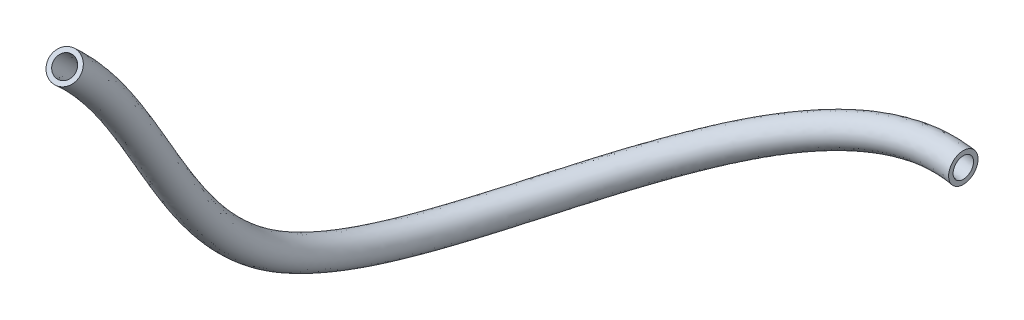
ISO-10303-21;
HEADER;
FILE_DESCRIPTION(('STEP AP214'),'2;1');
FILE_NAME('part.step','',(''),(''),'','','');
FILE_SCHEMA(('AUTOMOTIVE_DESIGN { 1 0 10303 214 1 1 1 1 }'));
ENDSEC;
DATA;
#1=APPLICATION_CONTEXT('core data for automotive mechanical design processes');
#2=APPLICATION_PROTOCOL_DEFINITION('international standard','automotive_design',2000,#1);
#3=PRODUCT_CONTEXT('',#1,'mechanical');
#4=PRODUCT('Part','Part','',(#3));
#5=PRODUCT_RELATED_PRODUCT_CATEGORY('part','',(#4));
#6=PRODUCT_DEFINITION_FORMATION('','',#4);
#7=PRODUCT_DEFINITION_CONTEXT('part definition',#1,'design');
#8=PRODUCT_DEFINITION('design','',#6,#7);
#9=PRODUCT_DEFINITION_SHAPE('','',#8);
#10=(LENGTH_UNIT() NAMED_UNIT(*) SI_UNIT(.MILLI.,.METRE.));
#11=(NAMED_UNIT(*) PLANE_ANGLE_UNIT() SI_UNIT($,.RADIAN.));
#12=(NAMED_UNIT(*) SI_UNIT($,.STERADIAN.) SOLID_ANGLE_UNIT());
#13=UNCERTAINTY_MEASURE_WITH_UNIT(LENGTH_MEASURE(1.E-05),#10,'distance_accuracy_value','');
#14=(GEOMETRIC_REPRESENTATION_CONTEXT(3) GLOBAL_UNCERTAINTY_ASSIGNED_CONTEXT((#13)) GLOBAL_UNIT_ASSIGNED_CONTEXT((#10,
#11,#12)) REPRESENTATION_CONTEXT('',''));
#15=CARTESIAN_POINT('',(0.,0.,0.));
#16=DIRECTION('',(0.,0.,1.));
#17=DIRECTION('',(1.,0.,0.));
#18=AXIS2_PLACEMENT_3D('',#15,#16,#17);
#19=CARTESIAN_POINT('',(104.354475628239,-106.968076916901,-150.630518963093));
#20=CARTESIAN_POINT('',(96.6669450493613,-106.531923984846,-151.75457960486));
#21=CARTESIAN_POINT('',(89.6782819596531,-106.629420104211,-151.185203954963));
#22=CARTESIAN_POINT('',(76.5466219044977,-107.489299465614,-147.266389305906));
#23=CARTESIAN_POINT('',(70.3939898116412,-108.26120282161,-143.885820382198));
#24=CARTESIAN_POINT('',(58.8169961832312,-110.099981602548,-134.694728393269));
#25=CARTESIAN_POINT('',(53.4111641296254,-111.162699229592,-128.886314347304));
#26=CARTESIAN_POINT('',(45.8694367458203,-112.624710208681,-118.873974965341));
#27=CARTESIAN_POINT('',(43.448789042552,-113.089819904108,-115.321684436815));
#28=CARTESIAN_POINT('',(39.9469035392655,-113.718589015815,-109.745300983269));
#29=CARTESIAN_POINT('',(38.8010636736251,-113.916809353893,-107.845213622765));
#30=CARTESIAN_POINT('',(37.1130576525043,-114.193950489695,-104.942469717482));
#31=CARTESIAN_POINT('',(36.5475688044177,-114.272653950778,-103.968661344577));
#32=CARTESIAN_POINT('',(35.4795036240606,-114.492394573737,-101.988133890171));
#33=CARTESIAN_POINT('',(34.9814933988317,-114.638055680527,-100.980007349216));
#34=CARTESIAN_POINT('',(26.5476292580396,-116.931851136387,-83.7376695674423));
#35=CARTESIAN_POINT('',(20.4528324459996,-118.181993178388,-65.5001667795523));
#36=CARTESIAN_POINT('',(13.7320140915473,-116.273729570391,-39.5073024480733));
#37=CARTESIAN_POINT('',(11.8937280386703,-115.008827715904,-31.0713663286685));
#38=CARTESIAN_POINT('',(8.94679178332503,-110.868571015868,-15.3722568511703));
#39=CARTESIAN_POINT('',(7.83835799532157,-107.995853963323,-8.11371704539263));
#40=CARTESIAN_POINT('',(6.55405113043139,-101.750569093555,2.23563997986221));
#41=CARTESIAN_POINT('',(6.17996100651952,-98.9279298107038,5.90997846078897));
#42=CARTESIAN_POINT('',(5.62585833533374,-92.5891131039901,12.7889225456114));
#43=CARTESIAN_POINT('',(5.44612675492662,-89.072777019453,15.9922745816929));
#44=CARTESIAN_POINT('',(5.12793916346876,-77.7301371088887,25.1043253225434));
#45=CARTESIAN_POINT('',(5.21202248797731,-69.109830154846,30.5077107025622));
#46=CARTESIAN_POINT('',(5.55574627484162,-51.2533700171128,41.1656123840569));
#47=CARTESIAN_POINT('',(5.81474537341159,-42.0202734380013,46.4207927839838));
#48=CARTESIAN_POINT('',(6.0597559861193,-24.4435107317867,58.1371249538663));
#49=CARTESIAN_POINT('',(6.04646918332652,-16.089010395079,64.60238448761));
#50=CARTESIAN_POINT('',(5.6555158989548,-8.97470300289388,72.4122758630428));
#51=CARTESIAN_POINT('',(104.354475628239,-96.0332456293864,-150.630518963093));
#52=CARTESIAN_POINT('',(96.2064123788206,-95.5970926972422,-151.937669706294));
#53=CARTESIAN_POINT('',(88.6710298507427,-95.7320201523245,-151.45669353658));
#54=CARTESIAN_POINT('',(74.510640624016,-96.7383976123601,-147.604736290024));
#55=CARTESIAN_POINT('',(67.8829713518705,-97.6115374365402,-144.222356953277));
#56=CARTESIAN_POINT('',(55.3304760351049,-99.7343472711044,-135.176024089556));
#57=CARTESIAN_POINT('',(49.4093616501224,-100.97775856922,-129.51493352595));
#58=CARTESIAN_POINT('',(40.9060848065566,-102.923923380134,-119.860597614305));
#59=CARTESIAN_POINT('',(38.133943426434,-103.587868668707,-116.44921777408));
#60=CARTESIAN_POINT('',(34.0595127350267,-104.601578193346,-111.104765143424));
#61=CARTESIAN_POINT('',(32.7155030889513,-104.942605149563,-109.285285251475));
#62=CARTESIAN_POINT('',(30.7219674029491,-105.45899252904,-106.505615606023));
#63=CARTESIAN_POINT('',(30.0353078014731,-105.63800508863,-105.584334390521));
#64=CARTESIAN_POINT('',(28.843527333607,-105.958148200182,-103.633600768794));
#65=CARTESIAN_POINT('',(28.3515617900636,-106.094355310512,-102.598665214989));
#66=CARTESIAN_POINT('',(19.8238983312604,-108.406217913058,-85.0640579381586));
#67=CARTESIAN_POINT('',(13.8186204642953,-109.585434742682,-66.8846980539361));
#68=CARTESIAN_POINT('',(7.31914813942375,-107.669616423876,-41.6238838446736));
#69=CARTESIAN_POINT('',(5.57355996342161,-106.419131262967,-33.5470216141467));
#70=CARTESIAN_POINT('',(2.83572895398655,-102.487673185848,-18.87536138908));
#71=CARTESIAN_POINT('',(1.84523848156255,-99.8104062181489,-12.2978197929291));
#72=CARTESIAN_POINT('',(0.734534116979948,-94.2795158137392,-3.26200593404757));
#73=CARTESIAN_POINT('',(0.407902811184621,-91.7675332174541,-0.0224550769431179));
#74=CARTESIAN_POINT('',(-0.0814755966903197,-86.0176366643226,6.15388376231448));
#75=CARTESIAN_POINT('',(-0.243339604323864,-82.778678621645,9.08706859081029));
#76=CARTESIAN_POINT('',(-0.529057290441601,-72.133900379615,17.5784229039912));
#77=CARTESIAN_POINT('',(-0.448133384830143,-63.7957049233138,22.8070037912323));
#78=CARTESIAN_POINT('',(-0.102987756132822,-46.0835879979444,33.3662366746253));
#79=CARTESIAN_POINT('',(0.159663862885906,-36.7187266152886,38.6974051543636));
#80=CARTESIAN_POINT('',(0.40567369435987,-18.4894788707348,50.9040121996291));
#81=CARTESIAN_POINT('',(0.389971753691889,-9.59437595359893,57.7973805183104));
#82=CARTESIAN_POINT('',(-0.0483421383284666,-1.88212843608224,66.3515890380079));
#83=CARTESIAN_POINT('',(104.354475628239,-96.0332456293864,-161.565350250608));
#84=CARTESIAN_POINT('',(94.6769007175452,-95.7801827984989,-162.872500994283));
#85=CARTESIAN_POINT('',(85.460232848468,-96.2271030391598,-162.014693518398));
#86=CARTESIAN_POINT('',(68.592025231546,-98.0841107946497,-156.834294022696));
#87=CARTESIAN_POINT('',(60.9570931645405,-99.4768479006666,-152.562563586332));
#88=CARTESIAN_POINT('',(47.1337776207733,-102.769344516544,-141.855031897481));
#89=CARTESIAN_POINT('',(40.9120468404059,-104.671160912733,-135.417875568017));
#90=CARTESIAN_POINT('',(32.3646103223991,-107.782404601989,-124.686450022603));
#91=CARTESIAN_POINT('',(29.6480272537628,-108.864720830787,-120.926990504855));
#92=CARTESIAN_POINT('',(25.7702911859993,-110.543739336569,-115.058753786321));
#93=CARTESIAN_POINT('',(24.5108573535465,-111.11260163604,-113.064338301305));
#94=CARTESIAN_POINT('',(22.6738511085819,-111.976314528865,-110.019419397953));
#95=CARTESIAN_POINT('',(22.0602038820287,-112.292655053945,-109.00416397255));
#96=CARTESIAN_POINT('',(20.9187293842193,-112.749551834826,-106.897999212063));
#97=CARTESIAN_POINT('',(20.3949252216768,-112.875936759271,-105.804421647971));
#98=CARTESIAN_POINT('',(11.5148678640183,-115.259333993886,-87.2213059102753));
#99=CARTESIAN_POINT('',(5.30915051567714,-116.420268349734,-68.1591507684227));
#100=CARTESIAN_POINT('',(-1.48305205928301,-114.173497413814,-41.3301664036183));
#101=CARTESIAN_POINT('',(-3.32174333204004,-112.758575643201,-32.6876772093448));
#102=CARTESIAN_POINT('',(-6.23399606528406,-108.259673635073,-16.7593397761455));
#103=CARTESIAN_POINT('',(-7.30623799198644,-105.174123760868,-9.48148082919761));
#104=CARTESIAN_POINT('',(-8.5113063008589,-98.6213138950163,0.685221146929952));
#105=CARTESIAN_POINT('',(-8.85562976591468,-95.6972732797722,4.28284467455746));
#106=CARTESIAN_POINT('',(-9.35703101870259,-89.1926194081422,11.0195856548442));
#107=CARTESIAN_POINT('',(-9.51378764578545,-85.6112793857515,14.1576070878942));
#108=CARTESIAN_POINT('',(-9.77493348344799,-74.1123479697179,23.1091273088678));
#109=CARTESIAN_POINT('',(-9.66835977382019,-65.4361170216402,28.4533095040009));
#110=CARTESIAN_POINT('',(-9.30504977517391,-47.5071976752228,39.1003176651109));
#111=CARTESIAN_POINT('',(-9.04860086166344,-38.2574561518914,44.4023319147723));
#112=CARTESIAN_POINT('',(-8.83643388144013,-20.7061275612925,56.3239691462591));
#113=CARTESIAN_POINT('',(-8.8811793311913,-12.3954923585703,62.9533063531883));
#114=CARTESIAN_POINT('',(-9.31960589891775,-5.40007895105143,70.9600842091269));
#115=CARTESIAN_POINT('',(104.354475628239,-106.968076916901,-161.565350250608));
#116=CARTESIAN_POINT('',(95.1374333880859,-106.715014086103,-162.689410892849));
#117=CARTESIAN_POINT('',(86.4674849574313,-107.124502991047,-161.74320393678));
#118=CARTESIAN_POINT('',(70.6280065119749,-108.835012647903,-156.495947038577));
#119=CARTESIAN_POINT('',(63.4681116243113,-110.126513285709,-152.226027015197));
#120=CARTESIAN_POINT('',(50.6202977688995,-113.134978848016,-141.373736201249));
#121=CARTESIAN_POINT('',(44.9138493199089,-114.856101573075,-134.789256389371));
#122=CARTESIAN_POINT('',(37.3279622616628,-117.483191430551,-123.699827373639));
#123=CARTESIAN_POINT('',(34.9628728698808,-118.366672066204,-119.799457167623));
#124=CARTESIAN_POINT('',(31.6576819902381,-119.66075015903,-113.69928962615));
#125=CARTESIAN_POINT('',(30.5964179382203,-120.086805840378,-111.624266672611));
#126=CARTESIAN_POINT('',(29.0649413581371,-120.711272489516,-108.456273509404));
#127=CARTESIAN_POINT('',(28.5724648849733,-120.92730391609,-107.388490926607));
#128=CARTESIAN_POINT('',(27.5547056746729,-121.283798208385,-105.25253233344));
#129=CARTESIAN_POINT('',(27.0248568304449,-121.419637129286,-104.185763782189));
#130=CARTESIAN_POINT('',(18.2385987907975,-123.784967217215,-85.8949175396888));
#131=CARTESIAN_POINT('',(11.9433624973814,-125.016826785312,-66.7746194940388));
#132=CARTESIAN_POINT('',(4.92981389284053,-122.777610560393,-39.2135850070179));
#133=CARTESIAN_POINT('',(2.99842474320866,-121.348272096138,-30.2120219238666));
#134=CARTESIAN_POINT('',(-0.122933235945588,-116.640571465094,-13.2562352382358));
#135=CARTESIAN_POINT('',(-1.31311847822746,-113.359571506042,-5.29737808166112));
#136=CARTESIAN_POINT('',(-2.69178928740749,-106.092367174832,6.18286706083973));
#137=CARTESIAN_POINT('',(-3.08357157057976,-102.857669873022,10.2152782122895));
#138=CARTESIAN_POINT('',(-3.64969708667851,-95.7640958478097,17.6546244381412));
#139=CARTESIAN_POINT('',(-3.82432128653498,-91.9053777835248,21.0628130787594));
#140=CARTESIAN_POINT('',(-4.11793702953761,-79.7085846990611,30.6350297274547));
#141=CARTESIAN_POINT('',(-4.00820390101275,-70.7502422530999,36.1540164153307));
#142=CARTESIAN_POINT('',(-3.64631574419944,-52.6769796944638,46.8996933745425));
#143=CARTESIAN_POINT('',(-3.39351935113774,-43.5590029746041,52.1257195443744));
#144=CARTESIAN_POINT('',(-3.18235158968067,-26.6601594223444,63.5570819005143));
#145=CARTESIAN_POINT('',(-3.22468190155667,-18.8901268000504,69.7583103224879));
#146=CARTESIAN_POINT('',(-3.61574786163454,-12.4926535178631,77.0207710341617));
#147=CARTESIAN_POINT('',(104.354475628239,-117.902908204416,-161.565350250608));
#148=CARTESIAN_POINT('',(95.5979660586265,-117.649845373706,-162.506320791414));
#149=CARTESIAN_POINT('',(87.4747370663946,-118.021902942933,-161.471714355163));
#150=CARTESIAN_POINT('',(72.6639877924038,-119.585914501157,-156.157600054459));
#151=CARTESIAN_POINT('',(65.9791300840821,-120.776178670751,-151.889490444062));
#152=CARTESIAN_POINT('',(54.1068179170259,-123.500613179487,-140.892440505018));
#153=CARTESIAN_POINT('',(48.9156517994119,-125.041042233417,-134.160637210726));
#154=CARTESIAN_POINT('',(42.2913142009265,-127.183978259113,-122.713204724675));
#155=CARTESIAN_POINT('',(40.2777184859988,-127.868623301621,-118.67192383039));
#156=CARTESIAN_POINT('',(37.5450727944769,-128.777760981491,-112.339825465978));
#157=CARTESIAN_POINT('',(36.6819785228941,-129.061010044717,-110.184195043917));
#158=CARTESIAN_POINT('',(35.4560316076923,-129.446230450167,-106.893127620855));
#159=CARTESIAN_POINT('',(35.0847258879179,-129.561952778234,-105.772817880663));
#160=CARTESIAN_POINT('',(34.1906819651267,-129.818044581944,-103.607065454816));
#161=CARTESIAN_POINT('',(33.654788439213,-129.963337499301,-102.567105916407));
#162=CARTESIAN_POINT('',(24.9623297175767,-132.310600440544,-84.5685291691022));
#163=CARTESIAN_POINT('',(18.5775744790857,-133.61338522089,-65.390088219655));
#164=CARTESIAN_POINT('',(11.342679844964,-131.381723706972,-37.0970036104175));
#165=CARTESIAN_POINT('',(9.31859281845736,-129.937968549075,-27.7363666383884));
#166=CARTESIAN_POINT('',(5.98812959339288,-125.021469295114,-9.75313070032603));
#167=CARTESIAN_POINT('',(4.68000103553159,-121.545019251216,-1.11327533412463));
#168=CARTESIAN_POINT('',(3.12772772604399,-113.563420454648,11.6805129747495));
#169=CARTESIAN_POINT('',(2.68848662475514,-110.018066466272,16.1477117500216));
#170=CARTESIAN_POINT('',(2.05763684534559,-102.335572287477,24.2896632214381));
#171=CARTESIAN_POINT('',(1.86514507271544,-98.1994761812981,27.9680190696246));
#172=CARTESIAN_POINT('',(1.53905942437275,-85.3048214284043,38.1609321460416));
#173=CARTESIAN_POINT('',(1.65195197179473,-76.0643674845595,43.8547233266606));
#174=CARTESIAN_POINT('',(2.01241828677505,-57.8467617137048,54.6990690839741));
#175=CARTESIAN_POINT('',(2.26156215938796,-48.8605497973168,59.8491071739766));
#176=CARTESIAN_POINT('',(2.47173070207876,-32.6141912833963,70.7901946547696));
#177=CARTESIAN_POINT('',(2.43181552807797,-25.3847612415304,76.5633142917875));
#178=CARTESIAN_POINT('',(2.08811017564874,-19.5852280846747,83.0814578591966));
#179=CARTESIAN_POINT('',(104.354475628239,-117.902908204416,-150.630518963093));
#180=CARTESIAN_POINT('',(97.127477719902,-117.46675527245,-151.571489503426));
#181=CARTESIAN_POINT('',(90.6855340685635,-117.526820056098,-150.913714373345));
#182=CARTESIAN_POINT('',(78.5826031849795,-118.240201318867,-146.928042321787));
#183=CARTESIAN_POINT('',(72.905008271412,-118.91086820668,-143.549283811118));
#184=CARTESIAN_POINT('',(62.3035163313575,-120.465615933992,-134.213432696982));
#185=CARTESIAN_POINT('',(57.4129666091283,-121.347639889964,-128.257695168659));
#186=CARTESIAN_POINT('',(50.832788685084,-122.325497037227,-117.887352316377));
#187=CARTESIAN_POINT('',(48.76363465867,-122.59177113951,-114.194151099551));
#188=CARTESIAN_POINT('',(45.8342943435044,-122.835599838284,-108.385836823113));
#189=CARTESIAN_POINT('',(44.8866242582989,-122.891013558223,-106.405141994055));
#190=CARTESIAN_POINT('',(43.5041479020594,-122.92890845035,-103.379323828942));
#191=CARTESIAN_POINT('',(43.0598298073623,-122.907302812927,-102.352988298634));
#192=CARTESIAN_POINT('',(42.1154799145143,-123.026640947291,-100.342667011547));
#193=CARTESIAN_POINT('',(41.6114250075998,-123.181756050543,-99.3613494834419));
#194=CARTESIAN_POINT('',(33.2713601848187,-125.457484359716,-82.4112811967259));
#195=CARTESIAN_POINT('',(27.0870444277039,-126.778551614095,-64.1156355051684));
#196=CARTESIAN_POINT('',(20.1448800436708,-124.877842716905,-37.3907210514729));
#197=CARTESIAN_POINT('',(18.213896113919,-123.598524168841,-28.5957110431902));
#198=CARTESIAN_POINT('',(15.0578546126635,-119.249468845888,-11.8691523132605));
#199=CARTESIAN_POINT('',(13.8314775090806,-116.181301708497,-3.92961429785614));
#200=CARTESIAN_POINT('',(12.3735681438828,-109.221622373371,7.73328589377199));
#201=CARTESIAN_POINT('',(11.9520192018545,-106.088326403954,11.842411998521));
#202=CARTESIAN_POINT('',(11.3331922673578,-99.1605895436576,19.4239613289084));
#203=CARTESIAN_POINT('',(11.1355931141771,-95.3668754172611,22.8974805725754));
#204=CARTESIAN_POINT('',(10.7849356173791,-83.3263738381624,32.6302277410955));
#205=CARTESIAN_POINT('',(10.8721783607848,-74.4239553863782,38.2084176138921));
#206=CARTESIAN_POINT('',(11.2144803058161,-56.4231520362813,48.9649880934885));
#207=CARTESIAN_POINT('',(11.4698268839373,-47.3218202607141,54.144180413604));
#208=CARTESIAN_POINT('',(11.7138382778788,-30.3975425928386,65.3702377081036));
#209=CARTESIAN_POINT('',(11.7029666129612,-22.583644836559,71.4073884569095));
#210=CARTESIAN_POINT('',(11.359373936238,-16.0672775697055,78.4729626880776));
#211=CARTESIAN_POINT('',(104.354475628239,-106.968076916901,-150.630518963093));
#212=CARTESIAN_POINT('',(96.6669450493613,-106.531923984846,-151.75457960486));
#213=CARTESIAN_POINT('',(89.6782819596531,-106.629420104211,-151.185203954963));
#214=CARTESIAN_POINT('',(76.5466219044977,-107.489299465614,-147.266389305906));
#215=CARTESIAN_POINT('',(70.3939898116412,-108.26120282161,-143.885820382198));
#216=CARTESIAN_POINT('',(58.8169961832312,-110.099981602548,-134.694728393269));
#217=CARTESIAN_POINT('',(53.4111641296254,-111.162699229592,-128.886314347304));
#218=CARTESIAN_POINT('',(45.8694367458203,-112.624710208681,-118.873974965341));
#219=CARTESIAN_POINT('',(43.448789042552,-113.089819904108,-115.321684436815));
#220=CARTESIAN_POINT('',(39.9469035392655,-113.718589015815,-109.745300983269));
#221=CARTESIAN_POINT('',(38.8010636736251,-113.916809353893,-107.845213622765));
#222=CARTESIAN_POINT('',(37.1130576525043,-114.193950489695,-104.942469717482));
#223=CARTESIAN_POINT('',(36.5475688044177,-114.272653950778,-103.968661344577));
#224=CARTESIAN_POINT('',(35.4795036240606,-114.492394573737,-101.988133890171));
#225=CARTESIAN_POINT('',(34.9814933988317,-114.638055680527,-100.980007349216));
#226=CARTESIAN_POINT('',(26.5476292580396,-116.931851136387,-83.7376695674423));
#227=CARTESIAN_POINT('',(20.4528324459996,-118.181993178388,-65.5001667795523));
#228=CARTESIAN_POINT('',(13.7320140915473,-116.273729570391,-39.5073024480733));
#229=CARTESIAN_POINT('',(11.8937280386703,-115.008827715904,-31.0713663286685));
#230=CARTESIAN_POINT('',(8.94679178332503,-110.868571015868,-15.3722568511703));
#231=CARTESIAN_POINT('',(7.83835799532157,-107.995853963323,-8.11371704539263));
#232=CARTESIAN_POINT('',(6.55405113043139,-101.750569093555,2.23563997986221));
#233=CARTESIAN_POINT('',(6.17996100651952,-98.9279298107038,5.90997846078897));
#234=CARTESIAN_POINT('',(5.62585833533374,-92.5891131039901,12.7889225456114));
#235=CARTESIAN_POINT('',(5.44612675492662,-89.072777019453,15.9922745816929));
#236=CARTESIAN_POINT('',(5.12793916346876,-77.7301371088887,25.1043253225434));
#237=CARTESIAN_POINT('',(5.21202248797731,-69.109830154846,30.5077107025622));
#238=CARTESIAN_POINT('',(5.55574627484162,-51.2533700171128,41.1656123840569));
#239=CARTESIAN_POINT('',(5.81474537341159,-42.0202734380013,46.4207927839838));
#240=CARTESIAN_POINT('',(6.0597559861193,-24.4435107317867,58.1371249538663));
#241=CARTESIAN_POINT('',(6.04646918332652,-16.089010395079,64.60238448761));
#242=CARTESIAN_POINT('',(5.6555158989548,-8.97470300289388,72.4122758630428));
#243=(BOUNDED_SURFACE() B_SPLINE_SURFACE(3,3,((#19,#20,#21,#22,#23,#24,#25,#26,#27,#28,#29,#30,
#31,#32,#33,#34,#35,#36,#37,#38,#39,#40,#41,#42,#43,#44,#45,#46,#47,#48,#49,#50),(#51,#52,#53,
#54,#55,#56,#57,#58,#59,#60,#61,#62,#63,#64,#65,#66,#67,#68,#69,#70,#71,#72,#73,#74,#75,#76,#77,
#78,#79,#80,#81,#82),(#83,#84,#85,#86,#87,#88,#89,#90,#91,#92,#93,#94,#95,#96,#97,#98,#99,#100,
#101,#102,#103,#104,#105,#106,#107,#108,#109,#110,#111,#112,#113,#114),(#115,#116,#117,#118,
#119,#120,#121,#122,#123,#124,#125,#126,#127,#128,#129,#130,#131,#132,#133,#134,#135,#136,#137,
#138,#139,#140,#141,#142,#143,#144,#145,#146),(#147,#148,#149,#150,#151,#152,#153,#154,#155,
#156,#157,#158,#159,#160,#161,#162,#163,#164,#165,#166,#167,#168,#169,#170,#171,#172,#173,#174,
#175,#176,#177,#178),(#179,#180,#181,#182,#183,#184,#185,#186,#187,#188,#189,#190,#191,#192,
#193,#194,#195,#196,#197,#198,#199,#200,#201,#202,#203,#204,#205,#206,#207,#208,#209,#210),
(#211,#212,#213,#214,#215,#216,#217,#218,#219,#220,#221,#222,#223,#224,#225,#226,#227,#228,#229,
#230,#231,#232,#233,#234,#235,#236,#237,#238,#239,#240,#241,#242)),.UNSPECIFIED.,.T.,.F.,
.F.) B_SPLINE_SURFACE_WITH_KNOTS((4,3,4),(4,2,2,2,2,2,2,2,2,2,2,2,2,2,2,4),(0.,0.5,1.),(0.,
0.0767942025694767,0.153588405138953,0.23038260770843,0.268779708993168,0.287978259635538,
0.297577534956722,0.307176810277907,0.46076521541686,0.537559417986337,0.614353620555814,
0.662559417986337,0.71076521541686,0.807176810277907,0.903588405138953,1.),
.UNSPECIFIED.) GEOMETRIC_REPRESENTATION_ITEM() RATIONAL_B_SPLINE_SURFACE(((1.,1.,1.,1.,1.,1.,1.,
1.,1.,1.,1.,1.,1.,1.,1.,1.,1.,1.,1.,1.,1.,1.,1.,1.,1.,1.,1.,1.,1.,1.,1.,1.),(0.333333333333333,
0.333333333333333,0.333333333333333,0.333333333333333,0.333333333333333,0.333333333333333,
0.333333333333333,0.333333333333333,0.333333333333333,0.333333333333333,0.333333333333333,
0.333333333333333,0.333333333333333,0.333333333333333,0.333333333333333,0.333333333333333,
0.333333333333333,0.333333333333333,0.333333333333333,0.333333333333333,0.333333333333333,
0.333333333333333,0.333333333333333,0.333333333333333,0.333333333333333,0.333333333333333,
0.333333333333333,0.333333333333333,0.333333333333333,0.333333333333333,0.333333333333333,
0.333333333333333),(0.333333333333333,0.333333333333333,0.333333333333333,0.333333333333333,
0.333333333333333,0.333333333333333,0.333333333333333,0.333333333333333,0.333333333333333,
0.333333333333333,0.333333333333333,0.333333333333333,0.333333333333333,0.333333333333333,
0.333333333333333,0.333333333333333,0.333333333333333,0.333333333333333,0.333333333333333,
0.333333333333333,0.333333333333333,0.333333333333333,0.333333333333333,0.333333333333333,
0.333333333333333,0.333333333333333,0.333333333333333,0.333333333333333,0.333333333333333,
0.333333333333333,0.333333333333333,0.333333333333333),(1.,1.,1.,1.,1.,1.,1.,1.,1.,1.,1.,1.,1.,
1.,1.,1.,1.,1.,1.,1.,1.,1.,1.,1.,1.,1.,1.,1.,1.,1.,1.,1.),(0.333333333333333,0.333333333333333,
0.333333333333333,0.333333333333333,0.333333333333333,0.333333333333333,0.333333333333333,
0.333333333333333,0.333333333333333,0.333333333333333,0.333333333333333,0.333333333333333,
0.333333333333333,0.333333333333333,0.333333333333333,0.333333333333333,0.333333333333333,
0.333333333333333,0.333333333333333,0.333333333333333,0.333333333333333,0.333333333333333,
0.333333333333333,0.333333333333333,0.333333333333333,0.333333333333333,0.333333333333333,
0.333333333333333,0.333333333333333,0.333333333333333,0.333333333333333,0.333333333333333),
(0.333333333333333,0.333333333333333,0.333333333333333,0.333333333333333,0.333333333333333,
0.333333333333333,0.333333333333333,0.333333333333333,0.333333333333333,0.333333333333333,
0.333333333333333,0.333333333333333,0.333333333333333,0.333333333333333,0.333333333333333,
0.333333333333333,0.333333333333333,0.333333333333333,0.333333333333333,0.333333333333333,
0.333333333333333,0.333333333333333,0.333333333333333,0.333333333333333,0.333333333333333,
0.333333333333333,0.333333333333333,0.333333333333333,0.333333333333333,0.333333333333333,
0.333333333333333,0.333333333333333),(1.,1.,1.,1.,1.,1.,1.,1.,1.,1.,1.,1.,1.,1.,1.,1.,1.,1.,1.,
1.,1.,1.,1.,1.,1.,1.,1.,1.,1.,1.,1.,1.))) REPRESENTATION_ITEM('') SURFACE());
#244=CARTESIAN_POINT('',(1.01988401866016,-10.7336782603785,74.7165234486022));
#245=DIRECTION('',(0.0950476576652543,0.689772176307763,0.717760606026829));
#246=DIRECTION('',(0.84786527718767,0.32171968844054,-0.421450962520184));
#247=AXIS2_PLACEMENT_3D('',#244,#245,#246);
#248=CIRCLE('',#247,5.46741564375748);
#249=CARTESIAN_POINT('',(5.6555158989548,-8.97470300289387,72.4122758630428));
#250=VERTEX_POINT('',#249);
#251=EDGE_CURVE('E62',#250,#250,#248,.T.);
#252=CARTESIAN_POINT('',(104.354475628239,-106.968076916901,-156.09793460685));
#253=DIRECTION('',(-1.,0.,0.));
#254=DIRECTION('',(0.,0.,1.));
#255=AXIS2_PLACEMENT_3D('',#252,#253,#254);
#256=CIRCLE('',#255,5.46741564375748);
#257=CARTESIAN_POINT('',(104.354475628239,-106.968076916901,-150.630518963093));
#258=VERTEX_POINT('',#257);
#259=EDGE_CURVE('E47',#258,#258,#256,.T.);
#260=ORIENTED_EDGE('',*,*,#251,.F.);
#261=EDGE_LOOP('',(#260));
#262=FACE_BOUND('',#261,.T.);
#263=ORIENTED_EDGE('',*,*,#259,.T.);
#264=EDGE_LOOP('',(#263));
#265=FACE_BOUND('',#264,.T.);
#266=ADVANCED_FACE('F42',(#262,#265),#243,.T.);
#267=CARTESIAN_POINT('',(104.354475628239,-106.968076916901,-156.09793460685));
#268=DIRECTION('',(-1.,0.,0.));
#269=DIRECTION('',(0.,0.,1.));
#270=AXIS2_PLACEMENT_3D('',#267,#268,#269);
#271=PLANE('',#270);
#272=CARTESIAN_POINT('',(104.354475628239,-106.968076916901,-156.09793460685));
#273=DIRECTION('',(-1.,0.,0.));
#274=DIRECTION('',(0.,0.,1.));
#275=AXIS2_PLACEMENT_3D('',#272,#273,#274);
#276=CIRCLE('',#275,3.80587417132711);
#277=CARTESIAN_POINT('',(104.354475628239,-106.968076916901,-152.292060435523));
#278=VERTEX_POINT('',#277);
#279=EDGE_CURVE('E52',#278,#278,#276,.F.);
#280=ORIENTED_EDGE('',*,*,#279,.F.);
#281=EDGE_LOOP('',(#280));
#282=FACE_BOUND('',#281,.T.);
#283=ORIENTED_EDGE('',*,*,#259,.F.);
#284=EDGE_LOOP('',(#283));
#285=FACE_BOUND('',#284,.T.);
#286=ADVANCED_FACE('F80',(#282,#285),#271,.F.);
#287=CARTESIAN_POINT('',(1.01988401866016,-10.7336782603785,74.7165234486022));
#288=DIRECTION('',(0.0950476576652543,0.689772176307763,0.717760606026829));
#289=DIRECTION('',(0.84786527718767,0.32171968844054,-0.421450962520184));
#290=AXIS2_PLACEMENT_3D('',#287,#288,#289);
#291=PLANE('',#290);
#292=CARTESIAN_POINT('',(1.01988401866016,-10.7336782603785,74.7165234486022));
#293=DIRECTION('',(0.0950476576652543,0.689772176307763,0.717760606026829));
#294=DIRECTION('',(0.84786527718767,0.32171968844054,-0.421450962520184));
#295=AXIS2_PLACEMENT_3D('',#292,#293,#294);
#296=CIRCLE('',#295,3.80587417132711);
#297=CARTESIAN_POINT('',(4.24675257787377,-9.50925360773521,73.1125341158657));
#298=VERTEX_POINT('',#297);
#299=EDGE_CURVE('E13',#298,#298,#296,.F.);
#300=ORIENTED_EDGE('',*,*,#299,.T.);
#301=EDGE_LOOP('',(#300));
#302=FACE_BOUND('',#301,.T.);
#303=ORIENTED_EDGE('',*,*,#251,.T.);
#304=EDGE_LOOP('',(#303));
#305=FACE_BOUND('',#304,.T.);
#306=ADVANCED_FACE('F69',(#302,#305),#291,.T.);
#307=CARTESIAN_POINT('',(104.354475628239,-106.968076916901,-152.292060435523));
#308=CARTESIAN_POINT('',(96.4345366115591,-106.559744422678,-153.41612107729));
#309=CARTESIAN_POINT('',(89.1904031586133,-106.704647670866,-152.78948612221));
#310=CARTESIAN_POINT('',(75.6472916198237,-107.693779827752,-148.668815419405));
#311=CARTESIAN_POINT('',(69.3416065111162,-108.544635698963,-145.153110095702));
#312=CARTESIAN_POINT('',(57.5715124629495,-110.561147729334,-135.709599878311));
#313=CARTESIAN_POINT('',(52.1200019169684,-111.723909641146,-129.783263075081));
#314=CARTESIAN_POINT('',(44.571564495377,-113.362953701549,-119.607260528292));
#315=CARTESIAN_POINT('',(42.1593588463297,-113.891634626257,-116.002079488209));
#316=CARTESIAN_POINT('',(38.6873609806648,-114.621497064055,-110.346107336762));
#317=CARTESIAN_POINT('',(37.5543723623973,-114.854336854542,-108.419438611153));
#318=CARTESIAN_POINT('',(35.8901509019131,-115.18425390702,-105.476390230074));
#319=CARTESIAN_POINT('',(35.3357562431961,-115.283824275309,-104.488302528771));
#320=CARTESIAN_POINT('',(34.275335026725,-115.524344541547,-102.484157400127));
#321=CARTESIAN_POINT('',(33.7724869412258,-115.668513172691,-101.467120238652));
#322=CARTESIAN_POINT('',(25.2850767454401,-117.973178275731,-84.0654621850802));
#323=CARTESIAN_POINT('',(19.159823266875,-119.22054230641,-65.6938191535561));
#324=CARTESIAN_POINT('',(12.3945247151879,-117.261990633655,-39.4626722479493));
#325=CARTESIAN_POINT('',(10.5420916990046,-115.972102728901,-30.9407894290286));
#326=CARTESIAN_POINT('',(7.56865216088748,-111.745623242138,-15.0507285555728));
#327=CARTESIAN_POINT('',(6.44779628530551,-108.81086783125,-7.68577592166517));
#328=CARTESIAN_POINT('',(4.64833297011053,-99.941948171036,6.89287961504241));
#329=CARTESIAN_POINT('',(4.14230535299487,-93.3273317829318,13.7020824942542));
#330=CARTESIAN_POINT('',(3.7230334688988,-78.0307611091721,25.9447127505653));
#331=CARTESIAN_POINT('',(3.81101426683739,-69.3590898516873,31.3656636842271));
#332=CARTESIAN_POINT('',(4.15749811952826,-51.4696867081221,42.0369027699913));
#333=CARTESIAN_POINT('',(4.41555472052357,-42.2540825268109,47.2876532010129));
#334=CARTESIAN_POINT('',(4.65542293089005,-24.7803292553312,58.9606843676685));
#335=CARTESIAN_POINT('',(4.63772298321674,-16.5146384599731,65.3858245223176));
#336=CARTESIAN_POINT('',(4.24675257787377,-9.50925360773522,73.1125341158657));
#337=CARTESIAN_POINT('',(104.354475628239,-114.579825259556,-152.292060435523));
#338=CARTESIAN_POINT('',(96.7551139209826,-114.171492765361,-153.288671851993));
#339=CARTESIAN_POINT('',(89.8915524831607,-114.290340018774,-152.60050191953));
#340=CARTESIAN_POINT('',(77.0645404761852,-115.177494684572,-148.433291703628));
#341=CARTESIAN_POINT('',(71.0895292816589,-115.957879736566,-144.918846610507));
#342=CARTESIAN_POINT('',(59.9984830545741,-117.776677431496,-135.374569403497));
#343=CARTESIAN_POINT('',(54.9056611182864,-118.813658275899,-129.345680558726));
#344=CARTESIAN_POINT('',(48.0265593557794,-120.115682310064,-118.920471394023));
#345=CARTESIAN_POINT('',(45.8590288500152,-120.505953555074,-115.217202265575));
#346=CARTESIAN_POINT('',(42.785580332981,-120.967858538963,-109.399782807739));
#347=CARTESIAN_POINT('',(41.7905379214741,-121.101290482145,-107.417003132737));
#348=CARTESIAN_POINT('',(40.3389960039278,-121.264667955674,-104.388282621132));
#349=CARTESIAN_POINT('',(39.8689484427549,-121.294413047806,-103.363630706542));
#350=CARTESIAN_POINT('',(38.8946455768993,-121.465043028945,-101.338746057532));
#351=CARTESIAN_POINT('',(38.3875897816846,-121.615792597632,-100.340370680001));
#352=CARTESIAN_POINT('',(29.965473396537,-123.907881139814,-83.1421617502635));
#353=CARTESIAN_POINT('',(23.7779056797583,-125.204616290348,-64.7300453781009));
#354=CARTESIAN_POINT('',(16.858527908213,-123.251323460156,-37.9893175601942));
#355=CARTESIAN_POINT('',(14.9415677958336,-121.951400078863,-29.2174830038098));
#356=CARTESIAN_POINT('',(11.8225698611059,-117.579575636106,-12.6122135516159));
#357=CARTESIAN_POINT('',(10.6196135110741,-114.508767201531,-4.77321729896933));
#358=CARTESIAN_POINT('',(8.65270190399871,-104.950778359046,11.0724163005046));
#359=CARTESIAN_POINT('',(8.11028338929932,-97.8705881784558,18.3647816477555));
#360=CARTESIAN_POINT('',(7.66087505517554,-81.9263077828351,31.183501878241));
#361=CARTESIAN_POINT('',(7.75105512810857,-73.0582583948207,36.7261344156907));
#362=CARTESIAN_POINT('',(8.09654923511897,-55.0683777790804,47.4660569625348));
#363=CARTESIAN_POINT('',(8.35206331251713,-45.9444952254818,52.6639120058527));
#364=CARTESIAN_POINT('',(8.59123596558087,-28.9249375221489,63.9956622811052));
#365=CARTESIAN_POINT('',(8.57521719798748,-21.0355607901781,70.1227954294096));
#366=CARTESIAN_POINT('',(8.21721456493683,-14.4464027309888,77.3313850229189));
#367=CARTESIAN_POINT('',(104.354475628239,-114.579825259556,-159.903808778177));
#368=CARTESIAN_POINT('',(95.6904191353708,-114.298941990659,-160.900420194647));
#369=CARTESIAN_POINT('',(87.6565130831242,-114.634967772405,-159.949937566853));
#370=CARTESIAN_POINT('',(72.9445856529045,-116.114247142479,-154.857997209302));
#371=CARTESIAN_POINT('',(66.2684176954345,-117.256324446014,-150.724473816553));
#372=CARTESIAN_POINT('',(54.2927520807503,-119.889342423336,-140.023834241338));
#373=CARTESIAN_POINT('',(48.9906707340054,-121.384639796031,-133.454725145117));
#374=CARTESIAN_POINT('',(42.0808293724476,-123.497676546318,-122.279752676479));
#375=CARTESIAN_POINT('',(39.951973069757,-124.179176272682,-118.334184893501));
#376=CARTESIAN_POINT('',(37.0154439011709,-125.104203585792,-112.15215874368));
#377=CARTESIAN_POINT('',(36.0792748085409,-125.396231967372,-110.04760620584));
#378=CARTESIAN_POINT('',(34.7366932107349,-125.801383120823,-106.834245387854));
#379=CARTESIAN_POINT('',(34.3174696457538,-125.926722364018,-105.744177920208));
#380=CARTESIAN_POINT('',(33.3781848221828,-126.192546728008,-103.611097480864));
#381=CARTESIAN_POINT('',(32.8489661285098,-126.336459062047,-102.571901334102));
#382=CARTESIAN_POINT('',(24.1815479544939,-128.678342942213,-84.6438244872342));
#383=CARTESIAN_POINT('',(17.8544540895175,-129.962351641613,-65.6171933444515));
#384=CARTESIAN_POINT('',(10.7313064621608,-127.778682323437,-37.784860519451));
#385=CARTESIAN_POINT('',(8.74953717946501,-126.364294433342,-28.6192923982579));
#386=CARTESIAN_POINT('',(5.50912408694891,-121.597471632553,-11.1392485299061));
#387=CARTESIAN_POINT('',(4.24926045755725,-118.242457008341,-2.81276058266524));
#388=CARTESIAN_POINT('',(2.19133010825577,-107.698775747794,14.1236711517891));
#389=CARTESIAN_POINT('',(1.65141259666038,-100.040557080371,21.7876151897117));
#390=CARTESIAN_POINT('',(1.22481025117005,-83.3035073726493,35.0334314272475));
#391=CARTESIAN_POINT('',(1.33284518139837,-74.2001510992468,40.6565341649843));
#392=CARTESIAN_POINT('',(1.69098352670466,-56.0593540745579,51.4575571812968));
#393=CARTESIAN_POINT('',(1.94217989388799,-47.0156065843213,56.6351179321851));
#394=CARTESIAN_POINT('',(2.15779450009529,-30.4679491657618,67.7685004001488));
#395=CARTESIAN_POINT('',(2.1215585133238,-22.9854210659236,73.7118411948722));
#396=CARTESIAN_POINT('',(1.7634774465095,-16.8952520362753,80.5393636883919));
#397=CARTESIAN_POINT('',(104.354475628239,-106.968076916901,-159.903808778177));
#398=CARTESIAN_POINT('',(95.3698418259473,-106.687193647975,-161.027869419945));
#399=CARTESIAN_POINT('',(86.9553637585769,-107.049275424498,-160.138921769533));
#400=CARTESIAN_POINT('',(71.5273367965431,-108.630532285659,-155.093520925078));
#401=CARTESIAN_POINT('',(64.5204949248918,-109.843080408411,-150.958737301693));
#402=CARTESIAN_POINT('',(51.8657814891258,-112.673812721174,-140.358864716207));
#403=CARTESIAN_POINT('',(46.2050115326874,-114.294891161278,-133.892307661473));
#404=CARTESIAN_POINT('',(38.6258345120453,-116.744947937803,-122.966541810748));
#405=CARTESIAN_POINT('',(36.2523030660716,-117.564857343929,-119.119062116166));
#406=CARTESIAN_POINT('',(32.9172245488546,-118.757842110853,-113.098483272688));
#407=CARTESIAN_POINT('',(31.8431092494642,-119.149278339761,-111.050041684256));
#408=CARTESIAN_POINT('',(30.2878481087202,-119.720969072174,-107.922352996796));
#409=CARTESIAN_POINT('',(29.7842774461949,-119.916133591526,-106.868849742429));
#410=CARTESIAN_POINT('',(28.7588742720085,-120.251848240607,-104.756508823467));
#411=CARTESIAN_POINT('',(28.2338632880509,-120.389179637106,-103.698650892753));
#412=CARTESIAN_POINT('',(19.501151303397,-122.74364007813,-85.5671249220509));
#413=CARTESIAN_POINT('',(13.2363716766343,-123.978277657803,-66.5809671199067));
#414=CARTESIAN_POINT('',(6.26730326913572,-121.789349496872,-39.258215207206));
#415=CARTESIAN_POINT('',(4.35006108263591,-120.384997083261,-30.3425988234767));
#416=CARTESIAN_POINT('',(1.25520638673049,-115.763519238704,-13.577763533863));
#417=CARTESIAN_POINT('',(0.0774432317886542,-112.544557638005,-5.72531920536107));
#418=CARTESIAN_POINT('',(-1.81303882563244,-102.689945559853,9.94413446632695));
#419=CARTESIAN_POINT('',(-2.31656543964404,-95.4973006849163,17.1249160362105));
#420=CARTESIAN_POINT('',(-2.7130313351067,-79.4079606989168,29.7946422995718));
#421=CARTESIAN_POINT('',(-2.60719567987283,-70.5009825561134,35.2960634335207));
#422=CARTESIAN_POINT('',(-2.24806758888607,-52.4606630035996,46.0284029887533));
#423=CARTESIAN_POINT('',(-1.99432869810562,-43.3251938856505,51.2588591273454));
#424=CARTESIAN_POINT('',(-1.77801853459553,-26.323340898944,62.7335224867121));
#425=CARTESIAN_POINT('',(-1.81593570144689,-18.4644987357186,68.9748702877802));
#426=CARTESIAN_POINT('',(-2.20698454055351,-11.9581029130217,76.3205127813387));
#427=CARTESIAN_POINT('',(104.354475628239,-99.3563285742472,-159.903808778177));
#428=CARTESIAN_POINT('',(95.0492645165238,-99.0754453052913,-161.155318645242));
#429=CARTESIAN_POINT('',(86.2542144340296,-99.4635830765901,-160.327905972213));
#430=CARTESIAN_POINT('',(70.1100879401816,-101.146817428839,-155.329044640855));
#431=CARTESIAN_POINT('',(62.7725721543491,-102.429836370808,-151.193000786832));
#432=CARTESIAN_POINT('',(49.4388108975012,-105.458283019012,-140.693895191077));
#433=CARTESIAN_POINT('',(43.4193523313694,-107.205142526525,-134.329890177828));
#434=CARTESIAN_POINT('',(35.170839651643,-109.992219329288,-123.653330945017));
#435=CARTESIAN_POINT('',(32.5526330623861,-110.950538415176,-119.903939338832));
#436=CARTESIAN_POINT('',(28.8190051965384,-112.411480635914,-114.044807801695));
#437=CARTESIAN_POINT('',(27.6069436903873,-112.90232471215,-112.052477162672));
#438=CARTESIAN_POINT('',(25.8390030067055,-113.640555023525,-109.010460605739));
#439=CARTESIAN_POINT('',(25.2510852466361,-113.905544819034,-107.99352156465));
#440=CARTESIAN_POINT('',(24.1395637218342,-114.311149753205,-105.901920166071));
#441=CARTESIAN_POINT('',(23.618760447592,-114.441900212165,-104.825400451404));
#442=CARTESIAN_POINT('',(14.8207546523001,-116.808937214048,-86.4904253568676));
#443=CARTESIAN_POINT('',(8.61828926375102,-117.994203673993,-67.544740895362));
#444=CARTESIAN_POINT('',(1.8033000761106,-115.800016670307,-40.7315698949611));
#445=CARTESIAN_POINT('',(-0.0494150141931576,-114.405699733179,-32.0659052486954));
#446=CARTESIAN_POINT('',(-2.998711313488,-109.929566844856,-16.01627853782));
#447=CARTESIAN_POINT('',(-4.09437399397995,-106.846658267669,-8.6378778280569));
#448=CARTESIAN_POINT('',(-5.81740775952064,-97.6811153719126,5.7645977808648));
#449=CARTESIAN_POINT('',(-6.28454347594852,-90.9540442894618,12.4622168827092));
#450=CARTESIAN_POINT('',(-6.65087292138348,-75.5124140251842,24.5558531718962));
#451=CARTESIAN_POINT('',(-6.54723654114399,-66.80181401298,29.9355927020572));
#452=CARTESIAN_POINT('',(-6.18711870447675,-48.8619719326414,40.5992487962097));
#453=CARTESIAN_POINT('',(-5.93083729009917,-39.6347811869796,45.8826003225056));
#454=CARTESIAN_POINT('',(-5.71383156928629,-22.1787326321263,57.6985445732754));
#455=CARTESIAN_POINT('',(-5.75342991621762,-13.9435764055135,64.2378993806883));
#456=CARTESIAN_POINT('',(-6.17744652761656,-7.02095378976819,72.1016618742856));
#457=CARTESIAN_POINT('',(104.354475628239,-99.3563285742472,-152.292060435523));
#458=CARTESIAN_POINT('',(96.1139593021356,-98.9479960799937,-153.543570302588));
#459=CARTESIAN_POINT('',(88.489253834066,-99.1189553229586,-152.97847032489));
#460=CARTESIAN_POINT('',(74.2300427634623,-100.210064970933,-148.904339135181));
#461=CARTESIAN_POINT('',(67.5936837405735,-101.131391661361,-145.387373580897));
#462=CARTESIAN_POINT('',(55.144541871325,-103.345618027172,-136.044630353125));
#463=CARTESIAN_POINT('',(49.3343427156505,-104.634161006393,-130.220845591437));
#464=CARTESIAN_POINT('',(41.1165696349748,-106.610225093035,-120.294049662561));
#465=CARTESIAN_POINT('',(38.4596888426442,-107.277315697441,-116.786956710843));
#466=CARTESIAN_POINT('',(34.5891416283485,-108.275135589148,-111.292431865786));
#467=CARTESIAN_POINT('',(33.3182068033205,-108.607383226939,-109.421874089568));
#468=CARTESIAN_POINT('',(31.4413057998984,-109.103839858367,-106.564497839016));
#469=CARTESIAN_POINT('',(30.8025640436373,-109.273235502813,-105.612974351001));
#470=CARTESIAN_POINT('',(29.6560244765507,-109.583646054149,-103.629568742722));
#471=CARTESIAN_POINT('',(29.1573841007668,-109.72123374775,-102.593869797303));
#472=CARTESIAN_POINT('',(20.6046800943432,-112.038475411649,-84.9887626198969));
#473=CARTESIAN_POINT('',(14.5417408539917,-113.236468322472,-66.6575929290114));
#474=CARTESIAN_POINT('',(7.93052152216282,-111.272657807154,-40.9360269357043));
#475=CARTESIAN_POINT('',(6.14261560217548,-109.992805378939,-32.6640958542474));
#476=CARTESIAN_POINT('',(3.314734460669,-105.91167084817,-17.4892435595298));
#477=CARTESIAN_POINT('',(2.2759790595369,-103.112968460969,-10.598334544361));
#478=CARTESIAN_POINT('',(0.6439640362223,-94.9331179830262,2.71334292958026));
#479=CARTESIAN_POINT('',(0.174327316690384,-88.7840753874078,9.03938334075293));
#480=CARTESIAN_POINT('',(-0.214808117377951,-74.1352144355091,20.7059236228896));
#481=CARTESIAN_POINT('',(-0.129026594433784,-65.659921308554,26.0051929527635));
#482=CARTESIAN_POINT('',(0.218447003937569,-47.8709956371639,36.6077485774477));
#483=CARTESIAN_POINT('',(0.479046128529961,-38.5636698281401,41.9113943961732));
#484=CARTESIAN_POINT('',(0.71960989619925,-20.6357209885134,53.9257064542318));
#485=CARTESIAN_POINT('',(0.700228768446068,-11.993716129768,60.6488536152256));
#486=CARTESIAN_POINT('',(0.276290590810774,-4.57210448448167,68.8936832088126));
#487=CARTESIAN_POINT('',(104.354475628239,-106.968076916901,-152.292060435523));
#488=CARTESIAN_POINT('',(96.4345366115591,-106.559744422678,-153.41612107729));
#489=CARTESIAN_POINT('',(89.1904031586133,-106.704647670866,-152.78948612221));
#490=CARTESIAN_POINT('',(75.6472916198237,-107.693779827752,-148.668815419405));
#491=CARTESIAN_POINT('',(69.3416065111162,-108.544635698963,-145.153110095702));
#492=CARTESIAN_POINT('',(57.5715124629495,-110.561147729334,-135.709599878311));
#493=CARTESIAN_POINT('',(52.1200019169684,-111.723909641146,-129.783263075081));
#494=CARTESIAN_POINT('',(44.571564495377,-113.362953701549,-119.607260528292));
#495=CARTESIAN_POINT('',(42.1593588463297,-113.891634626257,-116.002079488209));
#496=CARTESIAN_POINT('',(38.6873609806648,-114.621497064055,-110.346107336762));
#497=CARTESIAN_POINT('',(37.5543723623973,-114.854336854542,-108.419438611153));
#498=CARTESIAN_POINT('',(35.8901509019131,-115.18425390702,-105.476390230074));
#499=CARTESIAN_POINT('',(35.3357562431961,-115.283824275309,-104.488302528771));
#500=CARTESIAN_POINT('',(34.275335026725,-115.524344541547,-102.484157400127));
#501=CARTESIAN_POINT('',(33.7724869412258,-115.668513172691,-101.467120238652));
#502=CARTESIAN_POINT('',(25.2850767454401,-117.973178275731,-84.0654621850802));
#503=CARTESIAN_POINT('',(19.159823266875,-119.22054230641,-65.6938191535561));
#504=CARTESIAN_POINT('',(12.3945247151879,-117.261990633655,-39.4626722479493));
#505=CARTESIAN_POINT('',(10.5420916990046,-115.972102728901,-30.9407894290286));
#506=CARTESIAN_POINT('',(7.56865216088748,-111.745623242138,-15.0507285555728));
#507=CARTESIAN_POINT('',(6.44779628530551,-108.81086783125,-7.68577592166517));
#508=CARTESIAN_POINT('',(4.64833297011053,-99.941948171036,6.89287961504241));
#509=CARTESIAN_POINT('',(4.14230535299487,-93.3273317829318,13.7020824942542));
#510=CARTESIAN_POINT('',(3.7230334688988,-78.0307611091721,25.9447127505653));
#511=CARTESIAN_POINT('',(3.81101426683739,-69.3590898516873,31.3656636842271));
#512=CARTESIAN_POINT('',(4.15749811952826,-51.4696867081221,42.0369027699913));
#513=CARTESIAN_POINT('',(4.41555472052357,-42.2540825268109,47.2876532010129));
#514=CARTESIAN_POINT('',(4.65542293089005,-24.7803292553312,58.9606843676685));
#515=CARTESIAN_POINT('',(4.63772298321674,-16.5146384599731,65.3858245223176));
#516=CARTESIAN_POINT('',(4.24675257787377,-9.50925360773522,73.1125341158657));
#517=(BOUNDED_SURFACE() B_SPLINE_SURFACE(3,3,((#307,#308,#309,#310,#311,#312,#313,#314,#315,
#316,#317,#318,#319,#320,#321,#322,#323,#324,#325,#326,#327,#328,#329,#330,#331,#332,#333,#334,
#335,#336),(#337,#338,#339,#340,#341,#342,#343,#344,#345,#346,#347,#348,#349,#350,#351,#352,
#353,#354,#355,#356,#357,#358,#359,#360,#361,#362,#363,#364,#365,#366),(#367,#368,#369,#370,
#371,#372,#373,#374,#375,#376,#377,#378,#379,#380,#381,#382,#383,#384,#385,#386,#387,#388,#389,
#390,#391,#392,#393,#394,#395,#396),(#397,#398,#399,#400,#401,#402,#403,#404,#405,#406,#407,
#408,#409,#410,#411,#412,#413,#414,#415,#416,#417,#418,#419,#420,#421,#422,#423,#424,#425,#426),
(#427,#428,#429,#430,#431,#432,#433,#434,#435,#436,#437,#438,#439,#440,#441,#442,#443,#444,#445,
#446,#447,#448,#449,#450,#451,#452,#453,#454,#455,#456),(#457,#458,#459,#460,#461,#462,#463,
#464,#465,#466,#467,#468,#469,#470,#471,#472,#473,#474,#475,#476,#477,#478,#479,#480,#481,#482,
#483,#484,#485,#486),(#487,#488,#489,#490,#491,#492,#493,#494,#495,#496,#497,#498,#499,#500,
#501,#502,#503,#504,#505,#506,#507,#508,#509,#510,#511,#512,#513,#514,#515,#516)),.UNSPECIFIED.,
.T.,.F.,.F.) B_SPLINE_SURFACE_WITH_KNOTS((4,3,4),(4,2,2,2,2,2,2,2,2,2,2,2,2,2,4),(0.,0.5,1.),
(0.,0.0767942025694767,0.153588405138953,0.23038260770843,0.268779708993168,0.287978259635538,
0.297577534956722,0.307176810277907,0.46076521541686,0.537559417986337,0.614353620555814,
0.71076521541686,0.807176810277907,0.903588405138953,1.),
.UNSPECIFIED.) GEOMETRIC_REPRESENTATION_ITEM() RATIONAL_B_SPLINE_SURFACE(((1.,1.,1.,1.,1.,1.,1.,
1.,1.,1.,1.,1.,1.,1.,1.,1.,1.,1.,1.,1.,1.,1.,1.,1.,1.,1.,1.,1.,1.,1.),(0.333333333333333,
0.333333333333333,0.333333333333333,0.333333333333333,0.333333333333333,0.333333333333333,
0.333333333333333,0.333333333333333,0.333333333333333,0.333333333333333,0.333333333333333,
0.333333333333333,0.333333333333333,0.333333333333333,0.333333333333333,0.333333333333333,
0.333333333333333,0.333333333333333,0.333333333333333,0.333333333333333,0.333333333333333,
0.333333333333333,0.333333333333333,0.333333333333333,0.333333333333333,0.333333333333333,
0.333333333333333,0.333333333333333,0.333333333333333,0.333333333333333),(0.333333333333333,
0.333333333333333,0.333333333333333,0.333333333333333,0.333333333333333,0.333333333333333,
0.333333333333333,0.333333333333333,0.333333333333333,0.333333333333333,0.333333333333333,
0.333333333333333,0.333333333333333,0.333333333333333,0.333333333333333,0.333333333333333,
0.333333333333333,0.333333333333333,0.333333333333333,0.333333333333333,0.333333333333333,
0.333333333333333,0.333333333333333,0.333333333333333,0.333333333333333,0.333333333333333,
0.333333333333333,0.333333333333333,0.333333333333333,0.333333333333333),(1.,1.,1.,1.,1.,1.,1.,
1.,1.,1.,1.,1.,1.,1.,1.,1.,1.,1.,1.,1.,1.,1.,1.,1.,1.,1.,1.,1.,1.,1.),(0.333333333333333,
0.333333333333333,0.333333333333333,0.333333333333333,0.333333333333333,0.333333333333333,
0.333333333333333,0.333333333333333,0.333333333333333,0.333333333333333,0.333333333333333,
0.333333333333333,0.333333333333333,0.333333333333333,0.333333333333333,0.333333333333333,
0.333333333333333,0.333333333333333,0.333333333333333,0.333333333333333,0.333333333333333,
0.333333333333333,0.333333333333333,0.333333333333333,0.333333333333333,0.333333333333333,
0.333333333333333,0.333333333333333,0.333333333333333,0.333333333333333),(0.333333333333333,
0.333333333333333,0.333333333333333,0.333333333333333,0.333333333333333,0.333333333333333,
0.333333333333333,0.333333333333333,0.333333333333333,0.333333333333333,0.333333333333333,
0.333333333333333,0.333333333333333,0.333333333333333,0.333333333333333,0.333333333333333,
0.333333333333333,0.333333333333333,0.333333333333333,0.333333333333333,0.333333333333333,
0.333333333333333,0.333333333333333,0.333333333333333,0.333333333333333,0.333333333333333,
0.333333333333333,0.333333333333333,0.333333333333333,0.333333333333333),(1.,1.,1.,1.,1.,1.,1.,
1.,1.,1.,1.,1.,1.,1.,1.,1.,1.,1.,1.,1.,1.,1.,1.,1.,1.,1.,1.,1.,1.,1.))) REPRESENTATION_ITEM('') SURFACE());
#518=ORIENTED_EDGE('',*,*,#299,.F.);
#519=EDGE_LOOP('',(#518));
#520=FACE_BOUND('',#519,.T.);
#521=ORIENTED_EDGE('',*,*,#279,.T.);
#522=EDGE_LOOP('',(#521));
#523=FACE_BOUND('',#522,.T.);
#524=ADVANCED_FACE('F72',(#520,#523),#517,.T.);
#525=CLOSED_SHELL('',(#266,#286,#306,#524));
#526=MANIFOLD_SOLID_BREP('B2',#525);
#527=ADVANCED_BREP_SHAPE_REPRESENTATION('',(#18,#526),#14);
#528=SHAPE_DEFINITION_REPRESENTATION(#9,#527);
ENDSEC;
END-ISO-10303-21;
